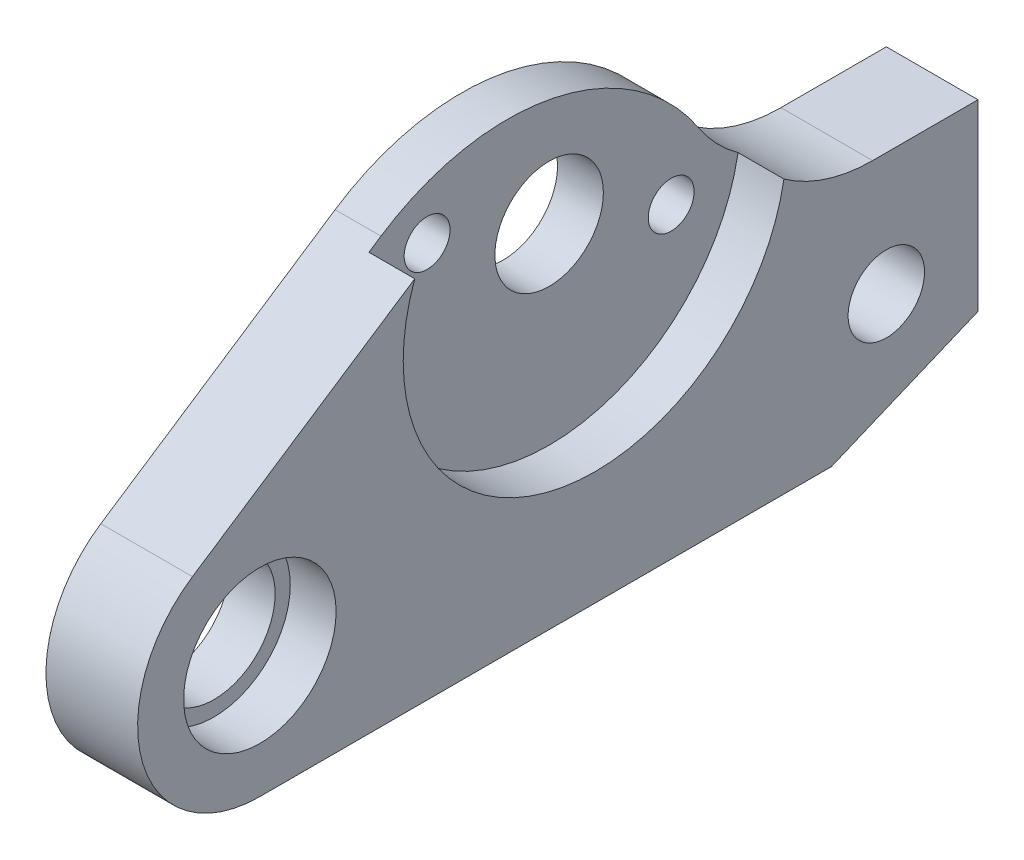
ISO-10303-21;
HEADER;
FILE_DESCRIPTION(('STEP AP214'),'2;1');
FILE_NAME('part.step','',(''),(''),'','','');
FILE_SCHEMA(('AUTOMOTIVE_DESIGN { 1 0 10303 214 1 1 1 1 }'));
ENDSEC;
DATA;
#1=APPLICATION_CONTEXT('core data for automotive mechanical design processes');
#2=APPLICATION_PROTOCOL_DEFINITION('international standard','automotive_design',2000,#1);
#3=PRODUCT_CONTEXT('',#1,'mechanical');
#4=PRODUCT('Part','Part','',(#3));
#5=PRODUCT_RELATED_PRODUCT_CATEGORY('part','',(#4));
#6=PRODUCT_DEFINITION_FORMATION('','',#4);
#7=PRODUCT_DEFINITION_CONTEXT('part definition',#1,'design');
#8=PRODUCT_DEFINITION('design','',#6,#7);
#9=PRODUCT_DEFINITION_SHAPE('','',#8);
#10=(LENGTH_UNIT() NAMED_UNIT(*) SI_UNIT(.MILLI.,.METRE.));
#11=(NAMED_UNIT(*) PLANE_ANGLE_UNIT() SI_UNIT($,.RADIAN.));
#12=(NAMED_UNIT(*) SI_UNIT($,.STERADIAN.) SOLID_ANGLE_UNIT());
#13=UNCERTAINTY_MEASURE_WITH_UNIT(LENGTH_MEASURE(1.E-05),#10,'distance_accuracy_value','');
#14=(GEOMETRIC_REPRESENTATION_CONTEXT(3) GLOBAL_UNCERTAINTY_ASSIGNED_CONTEXT((#13)) GLOBAL_UNIT_ASSIGNED_CONTEXT((#10,
#11,#12)) REPRESENTATION_CONTEXT('',''));
#15=CARTESIAN_POINT('',(0.,0.,0.));
#16=DIRECTION('',(0.,0.,1.));
#17=DIRECTION('',(1.,0.,0.));
#18=AXIS2_PLACEMENT_3D('',#15,#16,#17);
#19=CARTESIAN_POINT('',(6.,4.2927620809669,-19.1942750175218));
#20=DIRECTION('',(-1.,0.,0.));
#21=DIRECTION('',(0.,0.,1.));
#22=AXIS2_PLACEMENT_3D('',#19,#20,#21);
#23=CYLINDRICAL_SURFACE('',#22,15.);
#24=CARTESIAN_POINT('',(3.,4.2927620809669,-19.1942750175218));
#25=DIRECTION('',(1.,0.,0.));
#26=DIRECTION('',(0.,0.,-1.));
#27=AXIS2_PLACEMENT_3D('',#24,#25,#26);
#28=CIRCLE('',#27,15.);
#29=CARTESIAN_POINT('',(3.,12.5171048323868,-31.7386038679294));
#30=VERTEX_POINT('',#29);
#31=CARTESIAN_POINT('',(3.,16.8075132063466,-10.9249942586041));
#32=VERTEX_POINT('',#31);
#33=EDGE_CURVE('E48',#30,#32,#28,.T.);
#34=ORIENTED_EDGE('',*,*,#33,.F.);
#35=DIRECTION('',(-1.,0.,0.));
#36=VECTOR('',#35,1.);
#37=CARTESIAN_POINT('',(6.,12.5171048323868,-31.7386038679294));
#38=LINE('',#37,#36);
#39=CARTESIAN_POINT('',(0.,12.5171048323868,-31.7386038679294));
#40=VERTEX_POINT('',#39);
#41=EDGE_CURVE('E164',#30,#40,#38,.T.);
#42=ORIENTED_EDGE('',*,*,#41,.T.);
#43=CARTESIAN_POINT('',(0.,4.2927620809669,-19.1942750175218));
#44=DIRECTION('',(1.,0.,0.));
#45=DIRECTION('',(0.,0.,-1.));
#46=AXIS2_PLACEMENT_3D('',#43,#44,#45);
#47=CIRCLE('',#46,15.);
#48=CARTESIAN_POINT('',(0.,16.8075132063466,-10.9249942586041));
#49=VERTEX_POINT('',#48);
#50=EDGE_CURVE('E156',#40,#49,#47,.T.);
#51=ORIENTED_EDGE('',*,*,#50,.T.);
#52=DIRECTION('',(-1.,0.,0.));
#53=VECTOR('',#52,1.);
#54=CARTESIAN_POINT('',(6.,16.8075132063466,-10.9249942586041));
#55=LINE('',#54,#53);
#56=EDGE_CURVE('E162',#32,#49,#55,.T.);
#57=ORIENTED_EDGE('',*,*,#56,.F.);
#58=EDGE_LOOP('',(#34,#42,#51,#57));
#59=FACE_BOUND('',#58,.T.);
#60=ADVANCED_FACE('F33',(#59),#23,.T.);
#61=CARTESIAN_POINT('',(6.,12.,-21.9317121994613));
#62=DIRECTION('',(-1.,0.,0.));
#63=DIRECTION('',(0.,0.,1.));
#64=AXIS2_PLACEMENT_3D('',#61,#62,#63);
#65=CYLINDRICAL_SURFACE('',#64,3.54999999999999);
#66=CARTESIAN_POINT('',(0.,12.,-21.9317121994613));
#67=DIRECTION('',(1.,0.,0.));
#68=DIRECTION('',(0.,0.,-1.));
#69=AXIS2_PLACEMENT_3D('',#66,#67,#68);
#70=CIRCLE('',#69,3.54999999999999);
#71=CARTESIAN_POINT('',(0.,12.,-25.4817121994613));
#72=VERTEX_POINT('',#71);
#73=EDGE_CURVE('E146',#72,#72,#70,.T.);
#74=ORIENTED_EDGE('',*,*,#73,.F.);
#75=EDGE_LOOP('',(#74));
#76=FACE_BOUND('',#75,.T.);
#77=CARTESIAN_POINT('',(3.,12.,-21.9317121994613));
#78=DIRECTION('',(1.,0.,0.));
#79=DIRECTION('',(0.,0.,-1.));
#80=AXIS2_PLACEMENT_3D('',#77,#78,#79);
#81=CIRCLE('',#80,3.54999999999999);
#82=CARTESIAN_POINT('',(3.,12.,-25.4817121994613));
#83=VERTEX_POINT('',#82);
#84=EDGE_CURVE('E183',#83,#83,#81,.T.);
#85=ORIENTED_EDGE('',*,*,#84,.T.);
#86=EDGE_LOOP('',(#85));
#87=FACE_BOUND('',#86,.T.);
#88=ADVANCED_FACE('F268',(#76,#87),#65,.F.);
#89=CARTESIAN_POINT('',(6.,9.09282878173182,-29.9190994761415));
#90=DIRECTION('',(-1.,0.,0.));
#91=DIRECTION('',(0.,0.,1.));
#92=AXIS2_PLACEMENT_3D('',#89,#90,#91);
#93=CYLINDRICAL_SURFACE('',#92,1.5);
#94=CARTESIAN_POINT('',(0.,9.09282878173182,-29.9190994761415));
#95=DIRECTION('',(1.,0.,0.));
#96=DIRECTION('',(0.,0.,-1.));
#97=AXIS2_PLACEMENT_3D('',#94,#95,#96);
#98=CIRCLE('',#97,1.5);
#99=CARTESIAN_POINT('',(0.,9.09282878173182,-31.4190994761415));
#100=VERTEX_POINT('',#99);
#101=EDGE_CURVE('E220',#100,#100,#98,.T.);
#102=ORIENTED_EDGE('',*,*,#101,.F.);
#103=EDGE_LOOP('',(#102));
#104=FACE_BOUND('',#103,.T.);
#105=CARTESIAN_POINT('',(3.,9.09282878173182,-29.9190994761415));
#106=DIRECTION('',(1.,0.,0.));
#107=DIRECTION('',(0.,0.,-1.));
#108=AXIS2_PLACEMENT_3D('',#105,#106,#107);
#109=CIRCLE('',#108,1.5);
#110=CARTESIAN_POINT('',(3.,9.09282878173182,-31.4190994761415));
#111=VERTEX_POINT('',#110);
#112=EDGE_CURVE('E178',#111,#111,#109,.T.);
#113=ORIENTED_EDGE('',*,*,#112,.T.);
#114=EDGE_LOOP('',(#113));
#115=FACE_BOUND('',#114,.T.);
#116=ADVANCED_FACE('F273',(#104,#115),#93,.F.);
#117=CARTESIAN_POINT('',(6.,14.9071712182682,-13.9443249227811));
#118=DIRECTION('',(-1.,0.,0.));
#119=DIRECTION('',(0.,0.,1.));
#120=AXIS2_PLACEMENT_3D('',#117,#118,#119);
#121=CYLINDRICAL_SURFACE('',#120,1.5);
#122=CARTESIAN_POINT('',(0.,14.9071712182682,-13.9443249227811));
#123=DIRECTION('',(1.,0.,0.));
#124=DIRECTION('',(0.,0.,-1.));
#125=AXIS2_PLACEMENT_3D('',#122,#123,#124);
#126=CIRCLE('',#125,1.5);
#127=CARTESIAN_POINT('',(0.,14.9071712182682,-15.4443249227811));
#128=VERTEX_POINT('',#127);
#129=EDGE_CURVE('E217',#128,#128,#126,.T.);
#130=ORIENTED_EDGE('',*,*,#129,.F.);
#131=EDGE_LOOP('',(#130));
#132=FACE_BOUND('',#131,.T.);
#133=CARTESIAN_POINT('',(3.,14.9071712182682,-13.9443249227811));
#134=DIRECTION('',(1.,0.,0.));
#135=DIRECTION('',(0.,0.,-1.));
#136=AXIS2_PLACEMENT_3D('',#133,#134,#135);
#137=CIRCLE('',#136,1.5);
#138=CARTESIAN_POINT('',(3.,14.9071712182682,-15.4443249227811));
#139=VERTEX_POINT('',#138);
#140=EDGE_CURVE('E176',#139,#139,#137,.T.);
#141=ORIENTED_EDGE('',*,*,#140,.T.);
#142=EDGE_LOOP('',(#141));
#143=FACE_BOUND('',#142,.T.);
#144=ADVANCED_FACE('F304',(#132,#143),#121,.F.);
#145=CARTESIAN_POINT('',(6.,0.,0.));
#146=DIRECTION('',(-1.,0.,0.));
#147=DIRECTION('',(0.,0.,1.));
#148=AXIS2_PLACEMENT_3D('',#145,#146,#147);
#149=CYLINDRICAL_SURFACE('',#148,4.);
#150=CARTESIAN_POINT('',(0.,0.,0.));
#151=DIRECTION('',(1.,0.,0.));
#152=DIRECTION('',(0.,0.,-1.));
#153=AXIS2_PLACEMENT_3D('',#150,#151,#152);
#154=CIRCLE('',#153,4.);
#155=CARTESIAN_POINT('',(0.,0.,-4.));
#156=VERTEX_POINT('',#155);
#157=EDGE_CURVE('E212',#156,#156,#154,.T.);
#158=ORIENTED_EDGE('',*,*,#157,.F.);
#159=EDGE_LOOP('',(#158));
#160=FACE_BOUND('',#159,.T.);
#161=CARTESIAN_POINT('',(3.,0.,0.));
#162=DIRECTION('',(1.,0.,0.));
#163=DIRECTION('',(0.,0.,-1.));
#164=AXIS2_PLACEMENT_3D('',#161,#162,#163);
#165=CIRCLE('',#164,4.);
#166=CARTESIAN_POINT('',(3.,0.,-4.));
#167=VERTEX_POINT('',#166);
#168=EDGE_CURVE('E172',#167,#167,#165,.T.);
#169=ORIENTED_EDGE('',*,*,#168,.T.);
#170=EDGE_LOOP('',(#169));
#171=FACE_BOUND('',#170,.T.);
#172=ADVANCED_FACE('F298',(#160,#171),#149,.F.);
#173=CARTESIAN_POINT('',(6.,0.,0.));
#174=DIRECTION('',(1.,0.,0.));
#175=DIRECTION('',(0.,0.,-1.));
#176=AXIS2_PLACEMENT_3D('',#173,#174,#175);
#177=PLANE('',#176);
#178=CARTESIAN_POINT('',(6.,12.,-21.9317121994613));
#179=DIRECTION('',(1.,0.,0.));
#180=DIRECTION('',(0.,0.,-1.));
#181=AXIS2_PLACEMENT_3D('',#178,#179,#180);
#182=CIRCLE('',#181,12.55);
#183=CARTESIAN_POINT('',(6.,16.2864562597584,-10.1364253130317));
#184=VERTEX_POINT('',#183);
#185=CARTESIAN_POINT('',(6.,9.85678103131991,-34.2973546191777));
#186=VERTEX_POINT('',#185);
#187=EDGE_CURVE('E186',#184,#186,#182,.T.);
#188=ORIENTED_EDGE('',*,*,#187,.F.);
#189=DIRECTION('',(0.,-0.551285383927847,0.834316741691982));
#190=VECTOR('',#189,1.);
#191=CARTESIAN_POINT('',(6.,6.67453393353586,4.41028307142277));
#192=LINE('',#191,#190);
#193=CARTESIAN_POINT('',(6.,6.67453393353586,4.41028307142277));
#194=VERTEX_POINT('',#193);
#195=EDGE_CURVE('E57',#184,#194,#192,.T.);
#196=ORIENTED_EDGE('',*,*,#195,.T.);
#197=CARTESIAN_POINT('',(6.,0.,0.));
#198=DIRECTION('',(1.,0.,0.));
#199=DIRECTION('',(0.,0.,-1.));
#200=AXIS2_PLACEMENT_3D('',#197,#198,#199);
#201=CIRCLE('',#200,7.99999999999999);
#202=CARTESIAN_POINT('',(6.,-7.99999999999999,0.));
#203=VERTEX_POINT('',#202);
#204=EDGE_CURVE('E160',#194,#203,#201,.T.);
#205=ORIENTED_EDGE('',*,*,#204,.T.);
#206=DIRECTION('',(0.,0.,-1.));
#207=VECTOR('',#206,1.);
#208=CARTESIAN_POINT('',(6.,-7.99999999999999,-37.4));
#209=LINE('',#208,#207);
#210=CARTESIAN_POINT('',(6.,-7.99999999999999,-37.4));
#211=VERTEX_POINT('',#210);
#212=EDGE_CURVE('E99',#203,#211,#209,.T.);
#213=ORIENTED_EDGE('',*,*,#212,.T.);
#214=DIRECTION('',(0.,0.384615384615385,-0.923076923076923));
#215=VECTOR('',#214,1.);
#216=CARTESIAN_POINT('',(6.,-7.99999999999999,-37.4));
#217=LINE('',#216,#215);
#218=CARTESIAN_POINT('',(6.,-4.,-47.));
#219=VERTEX_POINT('',#218);
#220=EDGE_CURVE('E117',#211,#219,#217,.T.);
#221=ORIENTED_EDGE('',*,*,#220,.T.);
#222=DIRECTION('',(0.,1.,0.));
#223=VECTOR('',#222,1.);
#224=CARTESIAN_POINT('',(6.,-4.,-47.));
#225=LINE('',#224,#223);
#226=CARTESIAN_POINT('',(6.,8.,-47.));
#227=VERTEX_POINT('',#226);
#228=EDGE_CURVE('E108',#219,#227,#225,.T.);
#229=ORIENTED_EDGE('',*,*,#228,.T.);
#230=DIRECTION('',(0.,0.,1.));
#231=VECTOR('',#230,1.);
#232=CARTESIAN_POINT('',(6.,8.,-47.));
#233=LINE('',#232,#231);
#234=CARTESIAN_POINT('',(6.,8.00000000000001,-40.1014897682011));
#235=VERTEX_POINT('',#234);
#236=EDGE_CURVE('E114',#227,#235,#233,.T.);
#237=ORIENTED_EDGE('',*,*,#236,.T.);
#238=CARTESIAN_POINT('',(6.,18.,-40.1014897682011));
#239=DIRECTION('',(-1.,0.,0.));
#240=DIRECTION('',(0.,0.,1.));
#241=AXIS2_PLACEMENT_3D('',#238,#239,#240);
#242=CIRCLE('',#241,10.);
#243=EDGE_CURVE('E135',#235,#186,#242,.T.);
#244=ORIENTED_EDGE('',*,*,#243,.T.);
#245=EDGE_LOOP('',(#188,#196,#205,#213,#221,#229,#237,#244));
#246=FACE_BOUND('',#245,.T.);
#247=CARTESIAN_POINT('',(6.,0.,0.));
#248=DIRECTION('',(1.,0.,0.));
#249=DIRECTION('',(0.,0.,-1.));
#250=AXIS2_PLACEMENT_3D('',#247,#248,#249);
#251=CIRCLE('',#250,4.99);
#252=CARTESIAN_POINT('',(6.,0.,-4.99));
#253=VERTEX_POINT('',#252);
#254=EDGE_CURVE('E204',#253,#253,#251,.T.);
#255=ORIENTED_EDGE('',*,*,#254,.F.);
#256=EDGE_LOOP('',(#255));
#257=FACE_BOUND('',#256,.T.);
#258=CARTESIAN_POINT('',(6.,0.,-41.));
#259=DIRECTION('',(1.,0.,0.));
#260=DIRECTION('',(0.,0.,-1.));
#261=AXIS2_PLACEMENT_3D('',#258,#259,#260);
#262=CIRCLE('',#261,2.5);
#263=CARTESIAN_POINT('',(6.,0.,-43.5));
#264=VERTEX_POINT('',#263);
#265=EDGE_CURVE('E209',#264,#264,#262,.T.);
#266=ORIENTED_EDGE('',*,*,#265,.F.);
#267=EDGE_LOOP('',(#266));
#268=FACE_BOUND('',#267,.T.);
#269=ADVANCED_FACE('F110',(#246,#257,#268),#177,.T.);
#270=CARTESIAN_POINT('',(0.,0.,0.));
#271=DIRECTION('',(1.,0.,0.));
#272=DIRECTION('',(0.,0.,-1.));
#273=AXIS2_PLACEMENT_3D('',#270,#271,#272);
#274=PLANE('',#273);
#275=ORIENTED_EDGE('',*,*,#157,.T.);
#276=EDGE_LOOP('',(#275));
#277=FACE_BOUND('',#276,.T.);
#278=ORIENTED_EDGE('',*,*,#101,.T.);
#279=EDGE_LOOP('',(#278));
#280=FACE_BOUND('',#279,.T.);
#281=CARTESIAN_POINT('',(0.,0.,0.));
#282=DIRECTION('',(1.,0.,0.));
#283=DIRECTION('',(0.,0.,-1.));
#284=AXIS2_PLACEMENT_3D('',#281,#282,#283);
#285=CIRCLE('',#284,7.99999999999999);
#286=CARTESIAN_POINT('',(0.,6.67453393353586,4.41028307142277));
#287=VERTEX_POINT('',#286);
#288=CARTESIAN_POINT('',(0.,-7.99999999999999,0.));
#289=VERTEX_POINT('',#288);
#290=EDGE_CURVE('E142',#287,#289,#285,.T.);
#291=ORIENTED_EDGE('',*,*,#290,.F.);
#292=DIRECTION('',(0.,-0.551285383927847,0.834316741691982));
#293=VECTOR('',#292,1.);
#294=CARTESIAN_POINT('',(0.,6.67453393353586,4.41028307142277));
#295=LINE('',#294,#293);
#296=EDGE_CURVE('E90',#49,#287,#295,.T.);
#297=ORIENTED_EDGE('',*,*,#296,.F.);
#298=ORIENTED_EDGE('',*,*,#50,.F.);
#299=CARTESIAN_POINT('',(0.,18.,-40.1014897682011));
#300=DIRECTION('',(-1.,0.,0.));
#301=DIRECTION('',(0.,0.,1.));
#302=AXIS2_PLACEMENT_3D('',#299,#300,#301);
#303=CIRCLE('',#302,10.);
#304=CARTESIAN_POINT('',(0.,8.00000000000001,-40.1014897682011));
#305=VERTEX_POINT('',#304);
#306=EDGE_CURVE('E153',#305,#40,#303,.T.);
#307=ORIENTED_EDGE('',*,*,#306,.F.);
#308=DIRECTION('',(0.,0.,1.));
#309=VECTOR('',#308,1.);
#310=CARTESIAN_POINT('',(0.,8.,-47.));
#311=LINE('',#310,#309);
#312=CARTESIAN_POINT('',(0.,8.,-47.));
#313=VERTEX_POINT('',#312);
#314=EDGE_CURVE('E151',#313,#305,#311,.T.);
#315=ORIENTED_EDGE('',*,*,#314,.F.);
#316=DIRECTION('',(0.,1.,0.));
#317=VECTOR('',#316,1.);
#318=CARTESIAN_POINT('',(0.,-4.,-47.));
#319=LINE('',#318,#317);
#320=CARTESIAN_POINT('',(0.,-4.,-47.));
#321=VERTEX_POINT('',#320);
#322=EDGE_CURVE('E126',#321,#313,#319,.T.);
#323=ORIENTED_EDGE('',*,*,#322,.F.);
#324=DIRECTION('',(0.,0.384615384615385,-0.923076923076923));
#325=VECTOR('',#324,1.);
#326=CARTESIAN_POINT('',(0.,-7.99999999999999,-37.4));
#327=LINE('',#326,#325);
#328=CARTESIAN_POINT('',(0.,-7.99999999999999,-37.4));
#329=VERTEX_POINT('',#328);
#330=EDGE_CURVE('E148',#329,#321,#327,.T.);
#331=ORIENTED_EDGE('',*,*,#330,.F.);
#332=DIRECTION('',(0.,0.,-1.));
#333=VECTOR('',#332,1.);
#334=CARTESIAN_POINT('',(0.,-7.99999999999999,-37.4));
#335=LINE('',#334,#333);
#336=EDGE_CURVE('E145',#289,#329,#335,.T.);
#337=ORIENTED_EDGE('',*,*,#336,.F.);
#338=EDGE_LOOP('',(#291,#297,#298,#307,#315,#323,#331,#337));
#339=FACE_BOUND('',#338,.T.);
#340=ORIENTED_EDGE('',*,*,#73,.T.);
#341=EDGE_LOOP('',(#340));
#342=FACE_BOUND('',#341,.T.);
#343=ORIENTED_EDGE('',*,*,#129,.T.);
#344=EDGE_LOOP('',(#343));
#345=FACE_BOUND('',#344,.T.);
#346=CARTESIAN_POINT('',(0.,0.,-41.));
#347=DIRECTION('',(1.,0.,0.));
#348=DIRECTION('',(0.,0.,-1.));
#349=AXIS2_PLACEMENT_3D('',#346,#347,#348);
#350=CIRCLE('',#349,2.5);
#351=CARTESIAN_POINT('',(0.,0.,-43.5));
#352=VERTEX_POINT('',#351);
#353=EDGE_CURVE('E174',#352,#352,#350,.T.);
#354=ORIENTED_EDGE('',*,*,#353,.T.);
#355=EDGE_LOOP('',(#354));
#356=FACE_BOUND('',#355,.T.);
#357=ADVANCED_FACE('F234',(#277,#280,#339,#342,#345,#356),#274,.F.);
#358=CARTESIAN_POINT('',(6.,0.,0.));
#359=DIRECTION('',(-1.,0.,0.));
#360=DIRECTION('',(0.,0.,1.));
#361=AXIS2_PLACEMENT_3D('',#358,#359,#360);
#362=CYLINDRICAL_SURFACE('',#361,7.99999999999999);
#363=ORIENTED_EDGE('',*,*,#290,.T.);
#364=DIRECTION('',(-1.,0.,0.));
#365=VECTOR('',#364,1.);
#366=CARTESIAN_POINT('',(6.,-7.99999999999999,0.));
#367=LINE('',#366,#365);
#368=EDGE_CURVE('E41',#203,#289,#367,.T.);
#369=ORIENTED_EDGE('',*,*,#368,.F.);
#370=ORIENTED_EDGE('',*,*,#204,.F.);
#371=DIRECTION('',(-1.,0.,0.));
#372=VECTOR('',#371,1.);
#373=CARTESIAN_POINT('',(6.,6.67453393353586,4.41028307142277));
#374=LINE('',#373,#372);
#375=EDGE_CURVE('E141',#194,#287,#374,.T.);
#376=ORIENTED_EDGE('',*,*,#375,.T.);
#377=EDGE_LOOP('',(#363,#369,#370,#376));
#378=FACE_BOUND('',#377,.T.);
#379=ADVANCED_FACE('F35',(#378),#362,.T.);
#380=CARTESIAN_POINT('',(6.,-7.99999999999999,-37.4));
#381=DIRECTION('',(0.,1.,0.));
#382=DIRECTION('',(0.,0.,1.));
#383=AXIS2_PLACEMENT_3D('',#380,#381,#382);
#384=PLANE('',#383);
#385=ORIENTED_EDGE('',*,*,#336,.T.);
#386=DIRECTION('',(-1.,0.,0.));
#387=VECTOR('',#386,1.);
#388=CARTESIAN_POINT('',(6.,-7.99999999999999,-37.4));
#389=LINE('',#388,#387);
#390=EDGE_CURVE('E168',#211,#329,#389,.T.);
#391=ORIENTED_EDGE('',*,*,#390,.F.);
#392=ORIENTED_EDGE('',*,*,#212,.F.);
#393=ORIENTED_EDGE('',*,*,#368,.T.);
#394=EDGE_LOOP('',(#385,#391,#392,#393));
#395=FACE_BOUND('',#394,.T.);
#396=ADVANCED_FACE('F228',(#395),#384,.F.);
#397=CARTESIAN_POINT('',(6.,-7.99999999999999,-37.4));
#398=DIRECTION('',(0.,0.923076923076923,0.384615384615385));
#399=DIRECTION('',(0.,-0.384615384615385,0.923076923076923));
#400=AXIS2_PLACEMENT_3D('',#397,#398,#399);
#401=PLANE('',#400);
#402=ORIENTED_EDGE('',*,*,#330,.T.);
#403=DIRECTION('',(-1.,0.,0.));
#404=VECTOR('',#403,1.);
#405=CARTESIAN_POINT('',(6.,-4.,-47.));
#406=LINE('',#405,#404);
#407=EDGE_CURVE('E129',#219,#321,#406,.T.);
#408=ORIENTED_EDGE('',*,*,#407,.F.);
#409=ORIENTED_EDGE('',*,*,#220,.F.);
#410=ORIENTED_EDGE('',*,*,#390,.T.);
#411=EDGE_LOOP('',(#402,#408,#409,#410));
#412=FACE_BOUND('',#411,.T.);
#413=ADVANCED_FACE('F231',(#412),#401,.F.);
#414=CARTESIAN_POINT('',(6.,-4.,-47.));
#415=DIRECTION('',(0.,0.,1.));
#416=DIRECTION('',(1.,0.,0.));
#417=AXIS2_PLACEMENT_3D('',#414,#415,#416);
#418=PLANE('',#417);
#419=ORIENTED_EDGE('',*,*,#322,.T.);
#420=DIRECTION('',(-1.,0.,0.));
#421=VECTOR('',#420,1.);
#422=CARTESIAN_POINT('',(6.,8.,-47.));
#423=LINE('',#422,#421);
#424=EDGE_CURVE('E123',#227,#313,#423,.T.);
#425=ORIENTED_EDGE('',*,*,#424,.F.);
#426=ORIENTED_EDGE('',*,*,#228,.F.);
#427=ORIENTED_EDGE('',*,*,#407,.T.);
#428=EDGE_LOOP('',(#419,#425,#426,#427));
#429=FACE_BOUND('',#428,.T.);
#430=ADVANCED_FACE('F124',(#429),#418,.F.);
#431=CARTESIAN_POINT('',(6.,8.,-47.));
#432=DIRECTION('',(0.,-1.,0.));
#433=DIRECTION('',(0.,0.,-1.));
#434=AXIS2_PLACEMENT_3D('',#431,#432,#433);
#435=PLANE('',#434);
#436=ORIENTED_EDGE('',*,*,#314,.T.);
#437=DIRECTION('',(-1.,0.,0.));
#438=VECTOR('',#437,1.);
#439=CARTESIAN_POINT('',(6.,8.00000000000001,-40.1014897682011));
#440=LINE('',#439,#438);
#441=EDGE_CURVE('E130',#235,#305,#440,.T.);
#442=ORIENTED_EDGE('',*,*,#441,.F.);
#443=ORIENTED_EDGE('',*,*,#236,.F.);
#444=ORIENTED_EDGE('',*,*,#424,.T.);
#445=EDGE_LOOP('',(#436,#442,#443,#444));
#446=FACE_BOUND('',#445,.T.);
#447=ADVANCED_FACE('F132',(#446),#435,.F.);
#448=CARTESIAN_POINT('',(6.,18.,-40.1014897682011));
#449=DIRECTION('',(-1.,0.,0.));
#450=DIRECTION('',(0.,0.,1.));
#451=AXIS2_PLACEMENT_3D('',#448,#449,#450);
#452=CYLINDRICAL_SURFACE('',#451,10.);
#453=CARTESIAN_POINT('',(3.,18.,-40.1014897682011));
#454=DIRECTION('',(1.,0.,0.));
#455=DIRECTION('',(0.,0.,-1.));
#456=AXIS2_PLACEMENT_3D('',#453,#454,#455);
#457=CIRCLE('',#456,10.);
#458=CARTESIAN_POINT('',(3.,9.85678103131991,-34.2973546191777));
#459=VERTEX_POINT('',#458);
#460=EDGE_CURVE('E199',#459,#30,#457,.F.);
#461=ORIENTED_EDGE('',*,*,#460,.F.);
#462=DIRECTION('',(1.,0.,0.));
#463=VECTOR('',#462,1.);
#464=CARTESIAN_POINT('',(4.5,9.85678103131991,-34.2973546191777));
#465=LINE('',#464,#463);
#466=EDGE_CURVE('E201',#459,#186,#465,.T.);
#467=ORIENTED_EDGE('',*,*,#466,.T.);
#468=ORIENTED_EDGE('',*,*,#243,.F.);
#469=ORIENTED_EDGE('',*,*,#441,.T.);
#470=ORIENTED_EDGE('',*,*,#306,.T.);
#471=ORIENTED_EDGE('',*,*,#41,.F.);
#472=EDGE_LOOP('',(#461,#467,#468,#469,#470,#471));
#473=FACE_BOUND('',#472,.T.);
#474=ADVANCED_FACE('F239',(#473),#452,.F.);
#475=CARTESIAN_POINT('',(6.,6.67453393353586,4.41028307142277));
#476=DIRECTION('',(0.,-0.834316741691982,-0.551285383927847));
#477=DIRECTION('',(0.,0.551285383927847,-0.834316741691982));
#478=AXIS2_PLACEMENT_3D('',#475,#476,#477);
#479=PLANE('',#478);
#480=ORIENTED_EDGE('',*,*,#195,.F.);
#481=DIRECTION('',(1.,0.,0.));
#482=VECTOR('',#481,1.);
#483=CARTESIAN_POINT('',(3.,16.2864562597584,-10.1364253130317));
#484=LINE('',#483,#482);
#485=CARTESIAN_POINT('',(3.,16.2864562597584,-10.1364253130317));
#486=VERTEX_POINT('',#485);
#487=EDGE_CURVE('E11',#184,#486,#484,.F.);
#488=ORIENTED_EDGE('',*,*,#487,.T.);
#489=DIRECTION('',(0.,-0.551285383927847,0.834316741691982));
#490=VECTOR('',#489,1.);
#491=CARTESIAN_POINT('',(3.,6.67453393353586,4.41028307142277));
#492=LINE('',#491,#490);
#493=EDGE_CURVE('E196',#32,#486,#492,.T.);
#494=ORIENTED_EDGE('',*,*,#493,.F.);
#495=ORIENTED_EDGE('',*,*,#56,.T.);
#496=ORIENTED_EDGE('',*,*,#296,.T.);
#497=ORIENTED_EDGE('',*,*,#375,.F.);
#498=EDGE_LOOP('',(#480,#488,#494,#495,#496,#497));
#499=FACE_BOUND('',#498,.T.);
#500=ADVANCED_FACE('F253',(#499),#479,.F.);
#501=CARTESIAN_POINT('',(6.,0.,-41.));
#502=DIRECTION('',(-1.,0.,0.));
#503=DIRECTION('',(0.,0.,1.));
#504=AXIS2_PLACEMENT_3D('',#501,#502,#503);
#505=CYLINDRICAL_SURFACE('',#504,2.5);
#506=ORIENTED_EDGE('',*,*,#265,.T.);
#507=EDGE_LOOP('',(#506));
#508=FACE_BOUND('',#507,.T.);
#509=ORIENTED_EDGE('',*,*,#353,.F.);
#510=EDGE_LOOP('',(#509));
#511=FACE_BOUND('',#510,.T.);
#512=ADVANCED_FACE('F312',(#508,#511),#505,.F.);
#513=CARTESIAN_POINT('',(3.,0.,0.));
#514=DIRECTION('',(1.,0.,0.));
#515=DIRECTION('',(0.,0.,-1.));
#516=AXIS2_PLACEMENT_3D('',#513,#514,#515);
#517=CYLINDRICAL_SURFACE('',#516,4.99);
#518=CARTESIAN_POINT('',(3.,0.,0.));
#519=DIRECTION('',(1.,0.,0.));
#520=DIRECTION('',(0.,0.,-1.));
#521=AXIS2_PLACEMENT_3D('',#518,#519,#520);
#522=CIRCLE('',#521,4.99);
#523=CARTESIAN_POINT('',(3.,0.,-4.99));
#524=VERTEX_POINT('',#523);
#525=EDGE_CURVE('E175',#524,#524,#522,.T.);
#526=ORIENTED_EDGE('',*,*,#525,.F.);
#527=EDGE_LOOP('',(#526));
#528=FACE_BOUND('',#527,.T.);
#529=ORIENTED_EDGE('',*,*,#254,.T.);
#530=EDGE_LOOP('',(#529));
#531=FACE_BOUND('',#530,.T.);
#532=ADVANCED_FACE('F264',(#528,#531),#517,.F.);
#533=CARTESIAN_POINT('',(3.,0.,0.));
#534=DIRECTION('',(1.,0.,0.));
#535=DIRECTION('',(0.,0.,-1.));
#536=AXIS2_PLACEMENT_3D('',#533,#534,#535);
#537=PLANE('',#536);
#538=ORIENTED_EDGE('',*,*,#168,.F.);
#539=EDGE_LOOP('',(#538));
#540=FACE_BOUND('',#539,.T.);
#541=ORIENTED_EDGE('',*,*,#525,.T.);
#542=EDGE_LOOP('',(#541));
#543=FACE_BOUND('',#542,.T.);
#544=ADVANCED_FACE('F256',(#540,#543),#537,.T.);
#545=CARTESIAN_POINT('',(3.,12.,-21.9317121994613));
#546=DIRECTION('',(1.,0.,0.));
#547=DIRECTION('',(0.,0.,-1.));
#548=AXIS2_PLACEMENT_3D('',#545,#546,#547);
#549=CYLINDRICAL_SURFACE('',#548,12.55);
#550=CARTESIAN_POINT('',(3.,12.,-21.9317121994613));
#551=DIRECTION('',(1.,0.,0.));
#552=DIRECTION('',(0.,0.,-1.));
#553=AXIS2_PLACEMENT_3D('',#550,#551,#552);
#554=CIRCLE('',#553,12.55);
#555=EDGE_CURVE('E179',#486,#459,#554,.T.);
#556=ORIENTED_EDGE('',*,*,#555,.F.);
#557=ORIENTED_EDGE('',*,*,#487,.F.);
#558=ORIENTED_EDGE('',*,*,#187,.T.);
#559=ORIENTED_EDGE('',*,*,#466,.F.);
#560=EDGE_LOOP('',(#556,#557,#558,#559));
#561=FACE_BOUND('',#560,.T.);
#562=ADVANCED_FACE('F254',(#561),#549,.F.);
#563=CARTESIAN_POINT('',(3.,12.,-21.9317121994613));
#564=DIRECTION('',(1.,0.,0.));
#565=DIRECTION('',(0.,0.,-1.));
#566=AXIS2_PLACEMENT_3D('',#563,#564,#565);
#567=PLANE('',#566);
#568=ORIENTED_EDGE('',*,*,#140,.F.);
#569=EDGE_LOOP('',(#568));
#570=FACE_BOUND('',#569,.T.);
#571=ORIENTED_EDGE('',*,*,#112,.F.);
#572=EDGE_LOOP('',(#571));
#573=FACE_BOUND('',#572,.T.);
#574=ORIENTED_EDGE('',*,*,#84,.F.);
#575=EDGE_LOOP('',(#574));
#576=FACE_BOUND('',#575,.T.);
#577=ORIENTED_EDGE('',*,*,#460,.T.);
#578=ORIENTED_EDGE('',*,*,#33,.T.);
#579=ORIENTED_EDGE('',*,*,#493,.T.);
#580=ORIENTED_EDGE('',*,*,#555,.T.);
#581=EDGE_LOOP('',(#577,#578,#579,#580));
#582=FACE_BOUND('',#581,.T.);
#583=ADVANCED_FACE('F250',(#570,#573,#576,#582),#567,.T.);
#584=CLOSED_SHELL('',(#60,#88,#116,#144,#172,#269,#357,#379,#396,#413,#430,#447,#474,#500,#512,
#532,#544,#562,#583));
#585=MANIFOLD_SOLID_BREP('B2',#584);
#586=ADVANCED_BREP_SHAPE_REPRESENTATION('',(#18,#585),#14);
#587=SHAPE_DEFINITION_REPRESENTATION(#9,#586);
ENDSEC;
END-ISO-10303-21;
